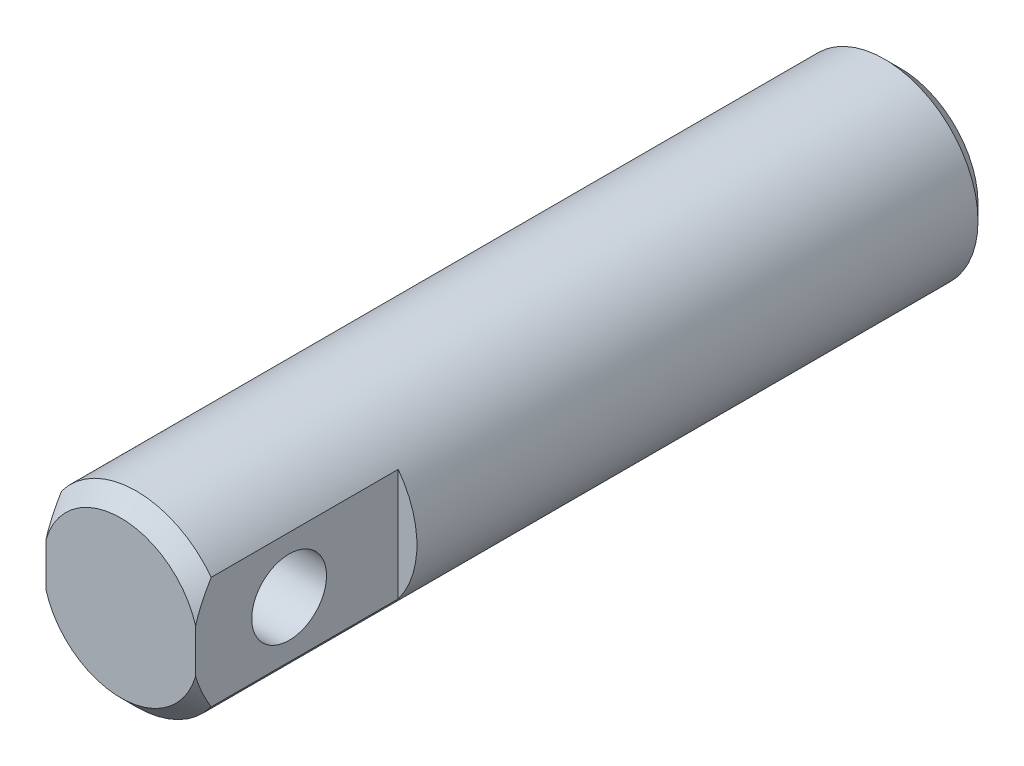
ISO-10303-21;
HEADER;
FILE_DESCRIPTION(('STEP AP214'),'2;1');
FILE_NAME('part.step','',(''),(''),'','','');
FILE_SCHEMA(('AUTOMOTIVE_DESIGN { 1 0 10303 214 1 1 1 1 }'));
ENDSEC;
DATA;
#1=APPLICATION_CONTEXT('core data for automotive mechanical design processes');
#2=APPLICATION_PROTOCOL_DEFINITION('international standard','automotive_design',2000,#1);
#3=PRODUCT_CONTEXT('',#1,'mechanical');
#4=PRODUCT('Part','Part','',(#3));
#5=PRODUCT_RELATED_PRODUCT_CATEGORY('part','',(#4));
#6=PRODUCT_DEFINITION_FORMATION('','',#4);
#7=PRODUCT_DEFINITION_CONTEXT('part definition',#1,'design');
#8=PRODUCT_DEFINITION('design','',#6,#7);
#9=PRODUCT_DEFINITION_SHAPE('','',#8);
#10=(LENGTH_UNIT() NAMED_UNIT(*) SI_UNIT(.MILLI.,.METRE.));
#11=(NAMED_UNIT(*) PLANE_ANGLE_UNIT() SI_UNIT($,.RADIAN.));
#12=(NAMED_UNIT(*) SI_UNIT($,.STERADIAN.) SOLID_ANGLE_UNIT());
#13=UNCERTAINTY_MEASURE_WITH_UNIT(LENGTH_MEASURE(1.E-05),#10,'distance_accuracy_value','');
#14=(GEOMETRIC_REPRESENTATION_CONTEXT(3) GLOBAL_UNCERTAINTY_ASSIGNED_CONTEXT((#13)) GLOBAL_UNIT_ASSIGNED_CONTEXT((#10,
#11,#12)) REPRESENTATION_CONTEXT('',''));
#15=CARTESIAN_POINT('',(0.,0.,0.));
#16=DIRECTION('',(0.,0.,1.));
#17=DIRECTION('',(1.,0.,0.));
#18=AXIS2_PLACEMENT_3D('',#15,#16,#17);
#19=CARTESIAN_POINT('',(0.,0.,0.));
#20=DIRECTION('',(0.,0.,1.));
#21=DIRECTION('',(1.,0.,0.));
#22=AXIS2_PLACEMENT_3D('',#19,#20,#21);
#23=PLANE('',#22);
#24=CARTESIAN_POINT('',(0.,0.,0.));
#25=DIRECTION('',(0.,0.,1.));
#26=DIRECTION('',(1.,0.,0.));
#27=AXIS2_PLACEMENT_3D('',#24,#25,#26);
#28=CIRCLE('',#27,2.5);
#29=CARTESIAN_POINT('',(2.5,0.,0.));
#30=VERTEX_POINT('',#29);
#31=EDGE_CURVE('E213',#30,#30,#28,.F.);
#32=ORIENTED_EDGE('',*,*,#31,.T.);
#33=EDGE_LOOP('',(#32));
#34=FACE_BOUND('',#33,.T.);
#35=DIRECTION('',(0.500185551006506,0.865918249354013,0.));
#36=VECTOR('',#35,1.);
#37=CARTESIAN_POINT('',(0.999257658257273,-1.7324791867189,0.));
#38=LINE('',#37,#36);
#39=CARTESIAN_POINT('',(0.999257658257273,-1.7324791867189,0.));
#40=VERTEX_POINT('',#39);
#41=CARTESIAN_POINT('',(2.,0.,0.));
#42=VERTEX_POINT('',#41);
#43=EDGE_CURVE('E50',#40,#42,#38,.T.);
#44=ORIENTED_EDGE('',*,*,#43,.T.);
#45=DIRECTION('',(-0.500185551006502,0.865918249354015,0.));
#46=VECTOR('',#45,1.);
#47=CARTESIAN_POINT('',(2.,0.,0.));
#48=LINE('',#47,#46);
#49=CARTESIAN_POINT('',(0.999257658257289,1.73247918671889,0.));
#50=VERTEX_POINT('',#49);
#51=EDGE_CURVE('E134',#42,#50,#48,.T.);
#52=ORIENTED_EDGE('',*,*,#51,.T.);
#53=DIRECTION('',(-1.,0.,0.));
#54=VECTOR('',#53,1.);
#55=CARTESIAN_POINT('',(0.999257658257289,1.73247918671889,0.));
#56=LINE('',#55,#54);
#57=CARTESIAN_POINT('',(-0.999257658257288,1.73247918671889,0.));
#58=VERTEX_POINT('',#57);
#59=EDGE_CURVE('E139',#50,#58,#56,.T.);
#60=ORIENTED_EDGE('',*,*,#59,.T.);
#61=DIRECTION('',(-0.500185551006502,-0.865918249354015,0.));
#62=VECTOR('',#61,1.);
#63=CARTESIAN_POINT('',(-0.999257658257288,1.73247918671889,0.));
#64=LINE('',#63,#62);
#65=CARTESIAN_POINT('',(-2.,0.,0.));
#66=VERTEX_POINT('',#65);
#67=EDGE_CURVE('E148',#58,#66,#64,.T.);
#68=ORIENTED_EDGE('',*,*,#67,.T.);
#69=DIRECTION('',(0.500185551006502,-0.865918249354015,0.));
#70=VECTOR('',#69,1.);
#71=CARTESIAN_POINT('',(-2.,0.,0.));
#72=LINE('',#71,#70);
#73=CARTESIAN_POINT('',(-0.999257658257288,-1.73247918671889,0.));
#74=VERTEX_POINT('',#73);
#75=EDGE_CURVE('E151',#66,#74,#72,.T.);
#76=ORIENTED_EDGE('',*,*,#75,.T.);
#77=DIRECTION('',(1.,0.,0.));
#78=VECTOR('',#77,1.);
#79=CARTESIAN_POINT('',(-0.999257658257288,-1.73247918671889,0.));
#80=LINE('',#79,#78);
#81=EDGE_CURVE('E144',#74,#40,#80,.T.);
#82=ORIENTED_EDGE('',*,*,#81,.T.);
#83=EDGE_LOOP('',(#44,#52,#60,#68,#76,#82));
#84=FACE_BOUND('',#83,.T.);
#85=ADVANCED_FACE('F34',(#34,#84),#23,.F.);
#86=CARTESIAN_POINT('',(0.,0.,25.));
#87=DIRECTION('',(0.,0.,-1.));
#88=DIRECTION('',(-1.,0.,0.));
#89=AXIS2_PLACEMENT_3D('',#86,#87,#88);
#90=CONICAL_SURFACE('',#89,2.49999999999999,0.785398163397453);
#91=CARTESIAN_POINT('',(-2.4,-4.86411981016494,22.0760105524034));
#92=CARTESIAN_POINT('',(-2.4,-4.75343904398374,22.1752525757856));
#93=CARTESIAN_POINT('',(-2.4,-4.6424406037317,22.2741434056256));
#94=CARTESIAN_POINT('',(-2.4,-4.41964149150724,22.471036659869));
#95=CARTESIAN_POINT('',(-2.4,-4.30784074934733,22.5690390048052));
#96=CARTESIAN_POINT('',(-2.4,-4.08288344036388,22.7643042597167));
#97=CARTESIAN_POINT('',(-2.4,-3.96972343139538,22.8615632109516));
#98=CARTESIAN_POINT('',(-2.4,-3.74223523526103,23.0546982153357));
#99=CARTESIAN_POINT('',(-2.4,-3.62790709485968,23.1505743234773));
#100=CARTESIAN_POINT('',(-2.4,-3.3910104025022,23.346179976773));
#101=CARTESIAN_POINT('',(-2.4,-3.26835369634245,23.4458030535129));
#102=CARTESIAN_POINT('',(-2.4,-3.02097816963854,23.6424528076332));
#103=CARTESIAN_POINT('',(-2.4,-2.89625945804493,23.739479621488));
#104=CARTESIAN_POINT('',(-2.4,-2.64434021655383,23.9298829737348));
#105=CARTESIAN_POINT('',(-2.4,-2.5171435774399,24.0232646364556));
#106=CARTESIAN_POINT('',(-2.4,-2.25931597512846,24.205135415471));
#107=CARTESIAN_POINT('',(-2.4,-2.12868602597436,24.2936259529448));
#108=CARTESIAN_POINT('',(-2.4,-1.89767283106985,24.4413252876953));
#109=CARTESIAN_POINT('',(-2.4,-1.79831993403233,24.5021369105638));
#110=CARTESIAN_POINT('',(-2.4,-1.59657013004918,24.6186387763622));
#111=CARTESIAN_POINT('',(-2.4,-1.4941720670768,24.6743270406203));
#112=CARTESIAN_POINT('',(-2.4,-1.28681517881027,24.7782510899381));
#113=CARTESIAN_POINT('',(-2.4,-1.18188921636933,24.8265516411797));
#114=CARTESIAN_POINT('',(-2.4,-0.968243341520211,24.9138789881778));
#115=CARTESIAN_POINT('',(-2.4,-0.859526745744456,24.9529136686686));
#116=CARTESIAN_POINT('',(-2.4,-0.67871397867689,25.0067783081651));
#117=CARTESIAN_POINT('',(-2.4,-0.607702554186699,25.0252458479283));
#118=CARTESIAN_POINT('',(-2.4,-0.464445674092852,25.056471746848));
#119=CARTESIAN_POINT('',(-2.4,-0.392200767680878,25.0692325813947));
#120=CARTESIAN_POINT('',(-2.4,-0.246990796707289,25.0883954965482));
#121=CARTESIAN_POINT('',(-2.4,-0.174027217247055,25.0948086890842));
#122=CARTESIAN_POINT('',(-2.4,-0.0278417356907183,25.1009482832641));
#123=CARTESIAN_POINT('',(-2.4,0.0453800332330288,25.1006777369763));
#124=CARTESIAN_POINT('',(-2.4,0.16956235746428,25.0945613107201));
#125=CARTESIAN_POINT('',(-2.4,0.220613638575744,25.090411765334));
#126=CARTESIAN_POINT('',(-2.4,0.322299295142587,25.0789822218707));
#127=CARTESIAN_POINT('',(-2.4,0.372934099273339,25.0717060066299));
#128=CARTESIAN_POINT('',(-2.4,0.510938341223032,25.0477310182714));
#129=CARTESIAN_POINT('',(-2.4,0.597797711718896,25.0280428167905));
#130=CARTESIAN_POINT('',(-2.4,0.76943571705135,24.981032697809));
#131=CARTESIAN_POINT('',(-2.4,0.854212815150112,24.9537053163765));
#132=CARTESIAN_POINT('',(-2.4,1.02248534096135,24.8924616471047));
#133=CARTESIAN_POINT('',(-2.4,1.10595291915121,24.8584697606695));
#134=CARTESIAN_POINT('',(-2.4,1.27057070813172,24.78542488708));
#135=CARTESIAN_POINT('',(-2.4,1.35172188385561,24.7463740459963));
#136=CARTESIAN_POINT('',(-2.4,1.57785101103819,24.6305367888808));
#137=CARTESIAN_POINT('',(-2.4,1.72044850878498,24.5491228979087));
#138=CARTESIAN_POINT('',(-2.4,2.00036407753434,24.3776204493347));
#139=CARTESIAN_POINT('',(-2.4,2.13767732286531,24.2875242141411));
#140=CARTESIAN_POINT('',(-2.4,2.40882965118526,24.1010670385392));
#141=CARTESIAN_POINT('',(-2.4,2.54265111223904,24.0046806560588));
#142=CARTESIAN_POINT('',(-2.4,2.80714311638325,23.8078094638806));
#143=CARTESIAN_POINT('',(-2.4,2.93781480178321,23.7073261766787));
#144=CARTESIAN_POINT('',(-2.4,3.18648942016496,23.511474710958));
#145=CARTESIAN_POINT('',(-2.4,3.30467335525612,23.4163353438188));
#146=CARTESIAN_POINT('',(-2.4,3.53946264006258,23.2241073999028));
#147=CARTESIAN_POINT('',(-2.4,3.65606781755013,23.1270186132858));
#148=CARTESIAN_POINT('',(-2.4,3.88690049850546,22.9322671615092));
#149=CARTESIAN_POINT('',(-2.4,4.00114006976859,22.8346187636832));
#150=CARTESIAN_POINT('',(-2.4,4.22856848808199,22.6381516856835));
#151=CARTESIAN_POINT('',(-2.4,4.34175754513042,22.5393332487987));
#152=CARTESIAN_POINT('',(-2.4,4.45454390995781,22.4400630986403));
#153=B_SPLINE_CURVE_WITH_KNOTS('',3,(#91,#92,#93,#94,#95,#96,#97,#98,#99,#100,#101,#102,#103,
#104,#105,#106,#107,#108,#109,#110,#111,#112,#113,#114,#115,#116,#117,#118,#119,#120,#121,#122,
#123,#124,#125,#126,#127,#128,#129,#130,#131,#132,#133,#134,#135,#136,#137,#138,#139,#140,#141,
#142,#143,#144,#145,#146,#147,#148,#149,#150,#151,#152),.UNSPECIFIED.,.F.,.F.,(4,2,2,2,2,2,2,2,
2,2,2,2,2,2,2,2,2,2,2,2,2,2,2,2,2,2,2,2,2,2,4),(0.,0.445976431845184,0.891992366426567,
1.33962217797752,1.78723413896789,2.26125979314329,2.7352604806808,3.208568880987,
3.6817390245889,4.03108709450084,4.38056952327395,4.72678680371362,5.07270840806284,
5.29263270599269,5.51246151489452,5.73190481600976,5.95124791220119,6.10481157834378,
6.25818997457503,6.52493203717333,6.79186537764819,7.06202293037782,7.33206625196202,
7.82413760975202,8.31664815868376,8.8112917366409,9.30575314082959,9.76088743256992,
10.2160709815331,10.6669202785461,11.1176774206207),.UNSPECIFIED.);
#154=CARTESIAN_POINT('',(-2.4,-1.80000000000002,24.5));
#155=VERTEX_POINT('',#154);
#156=CARTESIAN_POINT('',(-2.4,-0.699999999999971,25.));
#157=VERTEX_POINT('',#156);
#158=EDGE_CURVE('E43',#155,#157,#153,.T.);
#159=ORIENTED_EDGE('',*,*,#158,.F.);
#160=CARTESIAN_POINT('',(0.,0.,24.5));
#161=DIRECTION('',(0.,0.,1.));
#162=DIRECTION('',(1.,0.,0.));
#163=AXIS2_PLACEMENT_3D('',#160,#161,#162);
#164=CIRCLE('',#163,3.);
#165=CARTESIAN_POINT('',(2.4,-1.80000000000002,24.5));
#166=VERTEX_POINT('',#165);
#167=EDGE_CURVE('E210',#166,#155,#164,.F.);
#168=ORIENTED_EDGE('',*,*,#167,.F.);
#169=CARTESIAN_POINT('',(2.4,-4.86411981016494,22.0760105524034));
#170=CARTESIAN_POINT('',(2.4,-4.75343904398374,22.1752525757856));
#171=CARTESIAN_POINT('',(2.4,-4.6424406037317,22.2741434056256));
#172=CARTESIAN_POINT('',(2.4,-4.41964149150725,22.471036659869));
#173=CARTESIAN_POINT('',(2.4,-4.30784074934733,22.5690390048052));
#174=CARTESIAN_POINT('',(2.4,-4.08288344036388,22.7643042597167));
#175=CARTESIAN_POINT('',(2.4,-3.96972343139538,22.8615632109516));
#176=CARTESIAN_POINT('',(2.4,-3.74223523526103,23.0546982153357));
#177=CARTESIAN_POINT('',(2.4,-3.62790709485969,23.1505743234773));
#178=CARTESIAN_POINT('',(2.4,-3.3910104025022,23.346179976773));
#179=CARTESIAN_POINT('',(2.4,-3.26835369634245,23.4458030535129));
#180=CARTESIAN_POINT('',(2.4,-3.02097816963854,23.6424528076332));
#181=CARTESIAN_POINT('',(2.4,-2.89625945804494,23.739479621488));
#182=CARTESIAN_POINT('',(2.4,-2.64434021655383,23.9298829737348));
#183=CARTESIAN_POINT('',(2.4,-2.5171435774399,24.0232646364556));
#184=CARTESIAN_POINT('',(2.4,-2.25931597512846,24.205135415471));
#185=CARTESIAN_POINT('',(2.4,-2.12868602597436,24.2936259529448));
#186=CARTESIAN_POINT('',(2.4,-1.89767283106985,24.4413252876953));
#187=CARTESIAN_POINT('',(2.4,-1.79831993403233,24.5021369105638));
#188=CARTESIAN_POINT('',(2.4,-1.59657013004918,24.6186387763622));
#189=CARTESIAN_POINT('',(2.4,-1.4941720670768,24.6743270406203));
#190=CARTESIAN_POINT('',(2.4,-1.28681517881027,24.7782510899381));
#191=CARTESIAN_POINT('',(2.4,-1.18188921636933,24.8265516411797));
#192=CARTESIAN_POINT('',(2.4,-0.96824334152021,24.9138789881778));
#193=CARTESIAN_POINT('',(2.4,-0.859526745744454,24.9529136686686));
#194=CARTESIAN_POINT('',(2.4,-0.678713978676889,25.0067783081651));
#195=CARTESIAN_POINT('',(2.4,-0.607702554186697,25.0252458479283));
#196=CARTESIAN_POINT('',(2.4,-0.464445674092849,25.056471746848));
#197=CARTESIAN_POINT('',(2.4,-0.392200767680876,25.0692325813947));
#198=CARTESIAN_POINT('',(2.4,-0.246990796707287,25.0883954965482));
#199=CARTESIAN_POINT('',(2.4,-0.174027217247052,25.0948086890842));
#200=CARTESIAN_POINT('',(2.4,-0.0278417356907158,25.1009482832641));
#201=CARTESIAN_POINT('',(2.4,0.0453800332330313,25.1006777369763));
#202=CARTESIAN_POINT('',(2.4,0.169562357464282,25.0945613107201));
#203=CARTESIAN_POINT('',(2.4,0.220613638575746,25.090411765334));
#204=CARTESIAN_POINT('',(2.4,0.322299295142587,25.0789822218707));
#205=CARTESIAN_POINT('',(2.4,0.372934099273339,25.0717060066299));
#206=CARTESIAN_POINT('',(2.4,0.510938341223031,25.0477310182714));
#207=CARTESIAN_POINT('',(2.4,0.597797711718894,25.0280428167905));
#208=CARTESIAN_POINT('',(2.4,0.769435717051348,24.981032697809));
#209=CARTESIAN_POINT('',(2.4,0.85421281515011,24.9537053163765));
#210=CARTESIAN_POINT('',(2.4,1.02248534096134,24.8924616471047));
#211=CARTESIAN_POINT('',(2.4,1.10595291915121,24.8584697606695));
#212=CARTESIAN_POINT('',(2.4,1.27057070813172,24.78542488708));
#213=CARTESIAN_POINT('',(2.4,1.35172188385561,24.7463740459963));
#214=CARTESIAN_POINT('',(2.4,1.57785101103819,24.6305367888808));
#215=CARTESIAN_POINT('',(2.4,1.72044850878498,24.5491228979087));
#216=CARTESIAN_POINT('',(2.4,2.00036407753434,24.3776204493347));
#217=CARTESIAN_POINT('',(2.4,2.13767732286532,24.2875242141411));
#218=CARTESIAN_POINT('',(2.4,2.40882965118526,24.1010670385392));
#219=CARTESIAN_POINT('',(2.4,2.54265111223904,24.0046806560588));
#220=CARTESIAN_POINT('',(2.4,2.80714311638325,23.8078094638806));
#221=CARTESIAN_POINT('',(2.4,2.93781480178322,23.7073261766787));
#222=CARTESIAN_POINT('',(2.4,3.18648942016497,23.511474710958));
#223=CARTESIAN_POINT('',(2.4,3.30467335525612,23.4163353438188));
#224=CARTESIAN_POINT('',(2.4,3.53946264006258,23.2241073999028));
#225=CARTESIAN_POINT('',(2.4,3.65606781755013,23.1270186132858));
#226=CARTESIAN_POINT('',(2.4,3.88690049850546,22.9322671615092));
#227=CARTESIAN_POINT('',(2.4,4.00114006976859,22.8346187636832));
#228=CARTESIAN_POINT('',(2.4,4.22856848808199,22.6381516856835));
#229=CARTESIAN_POINT('',(2.4,4.34175754513042,22.5393332487987));
#230=CARTESIAN_POINT('',(2.4,4.45454390995781,22.4400630986403));
#231=B_SPLINE_CURVE_WITH_KNOTS('',3,(#169,#170,#171,#172,#173,#174,#175,#176,#177,#178,#179,
#180,#181,#182,#183,#184,#185,#186,#187,#188,#189,#190,#191,#192,#193,#194,#195,#196,#197,#198,
#199,#200,#201,#202,#203,#204,#205,#206,#207,#208,#209,#210,#211,#212,#213,#214,#215,#216,#217,
#218,#219,#220,#221,#222,#223,#224,#225,#226,#227,#228,#229,#230),.UNSPECIFIED.,.F.,.F.,(4,2,2,
2,2,2,2,2,2,2,2,2,2,2,2,2,2,2,2,2,2,2,2,2,2,2,2,2,2,2,4),(0.,0.445976431845183,
0.891992366426567,1.33962217797752,1.78723413896788,2.26125979314329,2.7352604806808,
3.208568880987,3.6817390245889,4.03108709450083,4.38056952327395,4.72678680371362,
5.07270840806285,5.2926327059927,5.51246151489452,5.73190481600976,5.95124791220119,
6.10481157834378,6.25818997457503,6.52493203717332,6.79186537764818,7.06202293037781,
7.33206625196202,7.82413760975202,8.31664815868376,8.8112917366409,9.3057531408296,
9.76088743256993,10.2160709815331,10.6669202785461,11.1176774206207),.UNSPECIFIED.);
#232=CARTESIAN_POINT('',(2.4,-0.699999999999972,25.));
#233=VERTEX_POINT('',#232);
#234=EDGE_CURVE('E216',#233,#166,#231,.F.);
#235=ORIENTED_EDGE('',*,*,#234,.F.);
#236=CARTESIAN_POINT('',(0.,0.,25.));
#237=DIRECTION('',(0.,0.,1.));
#238=DIRECTION('',(1.,0.,0.));
#239=AXIS2_PLACEMENT_3D('',#236,#237,#238);
#240=CIRCLE('',#239,2.49999999999999);
#241=EDGE_CURVE('E202',#157,#233,#240,.T.);
#242=ORIENTED_EDGE('',*,*,#241,.F.);
#243=EDGE_LOOP('',(#159,#168,#235,#242));
#244=FACE_BOUND('',#243,.T.);
#245=ADVANCED_FACE('F237',(#244),#90,.T.);
#246=CARTESIAN_POINT('',(0.,0.,25.));
#247=DIRECTION('',(0.,0.,-1.));
#248=DIRECTION('',(-1.,0.,0.));
#249=AXIS2_PLACEMENT_3D('',#246,#247,#248);
#250=CYLINDRICAL_SURFACE('',#249,3.);
#251=ORIENTED_EDGE('',*,*,#167,.T.);
#252=DIRECTION('',(0.,0.,-1.));
#253=VECTOR('',#252,1.);
#254=CARTESIAN_POINT('',(-2.4,-1.8,25.));
#255=LINE('',#254,#253);
#256=CARTESIAN_POINT('',(-2.4,-1.8,18.5));
#257=VERTEX_POINT('',#256);
#258=EDGE_CURVE('E187',#155,#257,#255,.T.);
#259=ORIENTED_EDGE('',*,*,#258,.T.);
#260=CARTESIAN_POINT('',(0.,0.,18.5));
#261=DIRECTION('',(0.,0.,-1.));
#262=DIRECTION('',(-1.,0.,0.));
#263=AXIS2_PLACEMENT_3D('',#260,#261,#262);
#264=CIRCLE('',#263,3.);
#265=CARTESIAN_POINT('',(-2.4,1.8,18.5));
#266=VERTEX_POINT('',#265);
#267=EDGE_CURVE('E11',#257,#266,#264,.T.);
#268=ORIENTED_EDGE('',*,*,#267,.T.);
#269=DIRECTION('',(0.,0.,-1.));
#270=VECTOR('',#269,1.);
#271=CARTESIAN_POINT('',(-2.4,1.8,25.));
#272=LINE('',#271,#270);
#273=CARTESIAN_POINT('',(-2.4,1.8,24.5));
#274=VERTEX_POINT('',#273);
#275=EDGE_CURVE('E184',#266,#274,#272,.F.);
#276=ORIENTED_EDGE('',*,*,#275,.T.);
#277=CARTESIAN_POINT('',(2.4,1.8,24.5));
#278=VERTEX_POINT('',#277);
#279=EDGE_CURVE('E209',#274,#278,#164,.F.);
#280=ORIENTED_EDGE('',*,*,#279,.T.);
#281=DIRECTION('',(0.,0.,-1.));
#282=VECTOR('',#281,1.);
#283=CARTESIAN_POINT('',(2.4,1.8,25.));
#284=LINE('',#283,#282);
#285=CARTESIAN_POINT('',(2.4,1.8,18.5));
#286=VERTEX_POINT('',#285);
#287=EDGE_CURVE('E199',#278,#286,#284,.T.);
#288=ORIENTED_EDGE('',*,*,#287,.T.);
#289=CARTESIAN_POINT('',(0.,0.,18.5));
#290=DIRECTION('',(0.,0.,-1.));
#291=DIRECTION('',(-1.,0.,0.));
#292=AXIS2_PLACEMENT_3D('',#289,#290,#291);
#293=CIRCLE('',#292,3.);
#294=CARTESIAN_POINT('',(2.4,-1.8,18.5));
#295=VERTEX_POINT('',#294);
#296=EDGE_CURVE('E224',#286,#295,#293,.T.);
#297=ORIENTED_EDGE('',*,*,#296,.T.);
#298=DIRECTION('',(0.,0.,-1.));
#299=VECTOR('',#298,1.);
#300=CARTESIAN_POINT('',(2.4,-1.8,25.));
#301=LINE('',#300,#299);
#302=EDGE_CURVE('E196',#295,#166,#301,.F.);
#303=ORIENTED_EDGE('',*,*,#302,.T.);
#304=EDGE_LOOP('',(#251,#259,#268,#276,#280,#288,#297,#303));
#305=FACE_BOUND('',#304,.T.);
#306=CARTESIAN_POINT('',(0.,0.,0.500000000000007));
#307=DIRECTION('',(0.,0.,1.));
#308=DIRECTION('',(1.,0.,0.));
#309=AXIS2_PLACEMENT_3D('',#306,#307,#308);
#310=CIRCLE('',#309,3.);
#311=CARTESIAN_POINT('',(3.,0.,0.500000000000007));
#312=VERTEX_POINT('',#311);
#313=EDGE_CURVE('E206',#312,#312,#310,.T.);
#314=ORIENTED_EDGE('',*,*,#313,.T.);
#315=EDGE_LOOP('',(#314));
#316=FACE_BOUND('',#315,.T.);
#317=ADVANCED_FACE('F36',(#305,#316),#250,.T.);
#318=CARTESIAN_POINT('',(0.,0.,25.));
#319=DIRECTION('',(0.,0.,1.));
#320=DIRECTION('',(1.,0.,0.));
#321=AXIS2_PLACEMENT_3D('',#318,#319,#320);
#322=PLANE('',#321);
#323=DIRECTION('',(0.,1.,0.));
#324=VECTOR('',#323,1.);
#325=CARTESIAN_POINT('',(-2.4,-3.,25.));
#326=LINE('',#325,#324);
#327=CARTESIAN_POINT('',(-2.4,0.699999999999971,25.));
#328=VERTEX_POINT('',#327);
#329=EDGE_CURVE('E58',#157,#328,#326,.T.);
#330=ORIENTED_EDGE('',*,*,#329,.F.);
#331=ORIENTED_EDGE('',*,*,#241,.T.);
#332=DIRECTION('',(0.,-1.,0.));
#333=VECTOR('',#332,1.);
#334=CARTESIAN_POINT('',(2.4,3.,25.));
#335=LINE('',#334,#333);
#336=CARTESIAN_POINT('',(2.4,0.699999999999971,25.));
#337=VERTEX_POINT('',#336);
#338=EDGE_CURVE('E190',#337,#233,#335,.T.);
#339=ORIENTED_EDGE('',*,*,#338,.F.);
#340=EDGE_CURVE('E203',#337,#328,#240,.T.);
#341=ORIENTED_EDGE('',*,*,#340,.T.);
#342=EDGE_LOOP('',(#330,#331,#339,#341));
#343=FACE_BOUND('',#342,.T.);
#344=ADVANCED_FACE('F235',(#343),#322,.T.);
#345=EDGE_CURVE('E239',#328,#274,#153,.T.);
#346=ORIENTED_EDGE('',*,*,#345,.F.);
#347=ORIENTED_EDGE('',*,*,#340,.F.);
#348=EDGE_CURVE('E223',#278,#337,#231,.F.);
#349=ORIENTED_EDGE('',*,*,#348,.F.);
#350=ORIENTED_EDGE('',*,*,#279,.F.);
#351=EDGE_LOOP('',(#346,#347,#349,#350));
#352=FACE_BOUND('',#351,.T.);
#353=ADVANCED_FACE('F230',(#352),#90,.T.);
#354=CARTESIAN_POINT('',(0.,0.,0.500000000000007));
#355=DIRECTION('',(0.,0.,1.));
#356=DIRECTION('',(1.,0.,0.));
#357=AXIS2_PLACEMENT_3D('',#354,#355,#356);
#358=CONICAL_SURFACE('',#357,3.,0.785398163397445);
#359=ORIENTED_EDGE('',*,*,#31,.F.);
#360=EDGE_LOOP('',(#359));
#361=FACE_BOUND('',#360,.T.);
#362=ORIENTED_EDGE('',*,*,#313,.F.);
#363=EDGE_LOOP('',(#362));
#364=FACE_BOUND('',#363,.T.);
#365=ADVANCED_FACE('F234',(#361,#364),#358,.T.);
#366=CARTESIAN_POINT('',(2.4,-3.,18.5));
#367=DIRECTION('',(0.,0.,-1.));
#368=DIRECTION('',(-1.,0.,0.));
#369=AXIS2_PLACEMENT_3D('',#366,#367,#368);
#370=PLANE('',#369);
#371=DIRECTION('',(0.,-1.,0.));
#372=VECTOR('',#371,1.);
#373=CARTESIAN_POINT('',(2.4,3.,18.5));
#374=LINE('',#373,#372);
#375=EDGE_CURVE('E193',#286,#295,#374,.T.);
#376=ORIENTED_EDGE('',*,*,#375,.T.);
#377=ORIENTED_EDGE('',*,*,#296,.F.);
#378=EDGE_LOOP('',(#376,#377));
#379=FACE_BOUND('',#378,.T.);
#380=ADVANCED_FACE('F252',(#379),#370,.F.);
#381=CARTESIAN_POINT('',(2.4,3.,18.5));
#382=DIRECTION('',(-1.,0.,0.));
#383=DIRECTION('',(0.,-1.,0.));
#384=AXIS2_PLACEMENT_3D('',#381,#382,#383);
#385=PLANE('',#384);
#386=CARTESIAN_POINT('',(2.4,0.,22.));
#387=DIRECTION('',(1.,0.,0.));
#388=DIRECTION('',(0.,1.,0.));
#389=AXIS2_PLACEMENT_3D('',#386,#387,#388);
#390=CIRCLE('',#389,1.2);
#391=CARTESIAN_POINT('',(2.4,1.2,22.));
#392=VERTEX_POINT('',#391);
#393=EDGE_CURVE('E130',#392,#392,#390,.T.);
#394=ORIENTED_EDGE('',*,*,#393,.F.);
#395=EDGE_LOOP('',(#394));
#396=FACE_BOUND('',#395,.T.);
#397=ORIENTED_EDGE('',*,*,#348,.T.);
#398=ORIENTED_EDGE('',*,*,#338,.T.);
#399=ORIENTED_EDGE('',*,*,#234,.T.);
#400=ORIENTED_EDGE('',*,*,#302,.F.);
#401=ORIENTED_EDGE('',*,*,#375,.F.);
#402=ORIENTED_EDGE('',*,*,#287,.F.);
#403=EDGE_LOOP('',(#397,#398,#399,#400,#401,#402));
#404=FACE_BOUND('',#403,.T.);
#405=ADVANCED_FACE('F226',(#396,#404),#385,.F.);
#406=CARTESIAN_POINT('',(-4.4,-3.,18.5));
#407=DIRECTION('',(0.,0.,-1.));
#408=DIRECTION('',(-1.,0.,0.));
#409=AXIS2_PLACEMENT_3D('',#406,#407,#408);
#410=PLANE('',#409);
#411=DIRECTION('',(0.,1.,0.));
#412=VECTOR('',#411,1.);
#413=CARTESIAN_POINT('',(-2.4,-3.,18.5));
#414=LINE('',#413,#412);
#415=EDGE_CURVE('E181',#257,#266,#414,.T.);
#416=ORIENTED_EDGE('',*,*,#415,.T.);
#417=ORIENTED_EDGE('',*,*,#267,.F.);
#418=EDGE_LOOP('',(#416,#417));
#419=FACE_BOUND('',#418,.T.);
#420=ADVANCED_FACE('F249',(#419),#410,.F.);
#421=CARTESIAN_POINT('',(-2.4,-3.,18.5));
#422=DIRECTION('',(1.,0.,0.));
#423=DIRECTION('',(0.,0.,-1.));
#424=AXIS2_PLACEMENT_3D('',#421,#422,#423);
#425=PLANE('',#424);
#426=CARTESIAN_POINT('',(-2.4,0.,22.));
#427=DIRECTION('',(1.,0.,0.));
#428=DIRECTION('',(0.,0.,-1.));
#429=AXIS2_PLACEMENT_3D('',#426,#427,#428);
#430=CIRCLE('',#429,1.2);
#431=CARTESIAN_POINT('',(-2.4,1.2,22.));
#432=VERTEX_POINT('',#431);
#433=EDGE_CURVE('E38',#432,#432,#430,.T.);
#434=ORIENTED_EDGE('',*,*,#433,.T.);
#435=EDGE_LOOP('',(#434));
#436=FACE_BOUND('',#435,.T.);
#437=ORIENTED_EDGE('',*,*,#158,.T.);
#438=ORIENTED_EDGE('',*,*,#329,.T.);
#439=ORIENTED_EDGE('',*,*,#345,.T.);
#440=ORIENTED_EDGE('',*,*,#275,.F.);
#441=ORIENTED_EDGE('',*,*,#415,.F.);
#442=ORIENTED_EDGE('',*,*,#258,.F.);
#443=EDGE_LOOP('',(#437,#438,#439,#440,#441,#442));
#444=FACE_BOUND('',#443,.T.);
#445=ADVANCED_FACE('F244',(#436,#444),#425,.F.);
#446=CARTESIAN_POINT('',(-3.,0.,22.));
#447=DIRECTION('',(1.,0.,0.));
#448=DIRECTION('',(0.,1.,0.));
#449=AXIS2_PLACEMENT_3D('',#446,#447,#448);
#450=CYLINDRICAL_SURFACE('',#449,1.2);
#451=CARTESIAN_POINT('',(2.4,1.2,22.));
#452=CARTESIAN_POINT('',(2.35,1.2,22.));
#453=CARTESIAN_POINT('',(2.3,1.2,22.));
#454=CARTESIAN_POINT('',(2.2,1.2,22.));
#455=CARTESIAN_POINT('',(2.15,1.2,22.));
#456=CARTESIAN_POINT('',(2.05,1.2,22.));
#457=CARTESIAN_POINT('',(2.,1.2,22.));
#458=CARTESIAN_POINT('',(1.9,1.2,22.));
#459=CARTESIAN_POINT('',(1.85,1.2,22.));
#460=CARTESIAN_POINT('',(1.75,1.2,22.));
#461=CARTESIAN_POINT('',(1.7,1.2,22.));
#462=CARTESIAN_POINT('',(1.6,1.2,22.));
#463=CARTESIAN_POINT('',(1.55,1.2,22.));
#464=CARTESIAN_POINT('',(1.45,1.2,22.));
#465=CARTESIAN_POINT('',(1.4,1.2,22.));
#466=CARTESIAN_POINT('',(1.3,1.2,22.));
#467=CARTESIAN_POINT('',(1.25,1.2,22.));
#468=CARTESIAN_POINT('',(1.15,1.2,22.));
#469=CARTESIAN_POINT('',(1.1,1.2,22.));
#470=CARTESIAN_POINT('',(1.,1.2,22.));
#471=CARTESIAN_POINT('',(0.95,1.2,22.));
#472=CARTESIAN_POINT('',(0.850000000000001,1.2,22.));
#473=CARTESIAN_POINT('',(0.800000000000001,1.2,22.));
#474=CARTESIAN_POINT('',(0.700000000000001,1.2,22.));
#475=CARTESIAN_POINT('',(0.650000000000001,1.2,22.));
#476=CARTESIAN_POINT('',(0.550000000000001,1.2,22.));
#477=CARTESIAN_POINT('',(0.500000000000001,1.2,22.));
#478=CARTESIAN_POINT('',(0.400000000000001,1.2,22.));
#479=CARTESIAN_POINT('',(0.35,1.2,22.));
#480=CARTESIAN_POINT('',(0.25,1.2,22.));
#481=CARTESIAN_POINT('',(0.2,1.2,22.));
#482=CARTESIAN_POINT('',(0.1,1.2,22.));
#483=CARTESIAN_POINT('',(0.0500000000000004,1.2,22.));
#484=CARTESIAN_POINT('',(-0.0499999999999995,1.2,22.));
#485=CARTESIAN_POINT('',(-0.0999999999999995,1.2,22.));
#486=CARTESIAN_POINT('',(-0.199999999999999,1.2,22.));
#487=CARTESIAN_POINT('',(-0.25,1.2,22.));
#488=CARTESIAN_POINT('',(-0.35,1.2,22.));
#489=CARTESIAN_POINT('',(-0.4,1.2,22.));
#490=CARTESIAN_POINT('',(-0.5,1.2,22.));
#491=CARTESIAN_POINT('',(-0.55,1.2,22.));
#492=CARTESIAN_POINT('',(-0.65,1.2,22.));
#493=CARTESIAN_POINT('',(-0.7,1.2,22.));
#494=CARTESIAN_POINT('',(-0.8,1.2,22.));
#495=CARTESIAN_POINT('',(-0.85,1.2,22.));
#496=CARTESIAN_POINT('',(-0.95,1.2,22.));
#497=CARTESIAN_POINT('',(-1.,1.2,22.));
#498=CARTESIAN_POINT('',(-1.1,1.2,22.));
#499=CARTESIAN_POINT('',(-1.15,1.2,22.));
#500=CARTESIAN_POINT('',(-1.25,1.2,22.));
#501=CARTESIAN_POINT('',(-1.3,1.2,22.));
#502=CARTESIAN_POINT('',(-1.4,1.2,22.));
#503=CARTESIAN_POINT('',(-1.45,1.2,22.));
#504=CARTESIAN_POINT('',(-1.55,1.2,22.));
#505=CARTESIAN_POINT('',(-1.6,1.2,22.));
#506=CARTESIAN_POINT('',(-1.7,1.2,22.));
#507=CARTESIAN_POINT('',(-1.75,1.2,22.));
#508=CARTESIAN_POINT('',(-1.85,1.2,22.));
#509=CARTESIAN_POINT('',(-1.9,1.2,22.));
#510=CARTESIAN_POINT('',(-2.,1.2,22.));
#511=CARTESIAN_POINT('',(-2.05,1.2,22.));
#512=CARTESIAN_POINT('',(-2.15,1.2,22.));
#513=CARTESIAN_POINT('',(-2.2,1.2,22.));
#514=CARTESIAN_POINT('',(-2.3,1.2,22.));
#515=CARTESIAN_POINT('',(-2.35,1.2,22.));
#516=CARTESIAN_POINT('',(-2.4,1.2,22.));
#517=B_SPLINE_CURVE_WITH_KNOTS('',3,(#451,#452,#453,#454,#455,#456,#457,#458,#459,#460,#461,
#462,#463,#464,#465,#466,#467,#468,#469,#470,#471,#472,#473,#474,#475,#476,#477,#478,#479,#480,
#481,#482,#483,#484,#485,#486,#487,#488,#489,#490,#491,#492,#493,#494,#495,#496,#497,#498,#499,
#500,#501,#502,#503,#504,#505,#506,#507,#508,#509,#510,#511,#512,#513,#514,#515,#516),
.UNSPECIFIED.,.F.,.F.,(4,2,2,2,2,2,2,2,2,2,2,2,2,2,2,2,2,2,2,2,2,2,2,2,2,2,2,2,2,2,2,2,4),(0.,
0.15,0.3,0.45,0.6,0.750000000000001,0.9,1.05,1.2,1.35,1.5,1.65,1.8,1.95,2.1,2.25,2.4,2.55,2.7,
2.85,3.,3.15,3.3,3.45,3.6,3.75,3.9,4.05,4.2,4.35,4.5,4.65,4.8),.UNSPECIFIED.);
#518=EDGE_CURVE('BSEAM248',#392,#432,#517,.T.);
#519=ORIENTED_EDGE('',*,*,#393,.T.);
#520=ORIENTED_EDGE('',*,*,#433,.F.);
#521=ORIENTED_EDGE('',*,*,#518,.T.);
#522=ORIENTED_EDGE('',*,*,#518,.F.);
#523=EDGE_LOOP('',(#519,#521,#520,#522));
#524=FACE_BOUND('',#523,.T.);
#525=ADVANCED_FACE('F248',(#524),#450,.F.);
#526=CARTESIAN_POINT('',(0.999257658257273,-1.7324791867189,3.5));
#527=DIRECTION('',(-0.865918249354013,0.500185551006506,0.));
#528=DIRECTION('',(-0.500185551006506,-0.865918249354013,0.));
#529=AXIS2_PLACEMENT_3D('',#526,#527,#528);
#530=PLANE('',#529);
#531=DIRECTION('',(0.,0.,-1.));
#532=VECTOR('',#531,1.);
#533=CARTESIAN_POINT('',(2.,0.,3.5));
#534=LINE('',#533,#532);
#535=CARTESIAN_POINT('',(2.,0.,3.5));
#536=VERTEX_POINT('',#535);
#537=EDGE_CURVE('E122',#536,#42,#534,.T.);
#538=ORIENTED_EDGE('',*,*,#537,.T.);
#539=ORIENTED_EDGE('',*,*,#43,.F.);
#540=DIRECTION('',(0.,0.,-1.));
#541=VECTOR('',#540,1.);
#542=CARTESIAN_POINT('',(0.999257658257273,-1.7324791867189,3.5));
#543=LINE('',#542,#541);
#544=CARTESIAN_POINT('',(0.999257658257273,-1.7324791867189,3.5));
#545=VERTEX_POINT('',#544);
#546=EDGE_CURVE('E169',#545,#40,#543,.T.);
#547=ORIENTED_EDGE('',*,*,#546,.F.);
#548=DIRECTION('',(0.500185551006506,0.865918249354013,0.));
#549=VECTOR('',#548,1.);
#550=CARTESIAN_POINT('',(0.999257658257273,-1.7324791867189,3.5));
#551=LINE('',#550,#549);
#552=EDGE_CURVE('E126',#545,#536,#551,.T.);
#553=ORIENTED_EDGE('',*,*,#552,.T.);
#554=EDGE_LOOP('',(#538,#539,#547,#553));
#555=FACE_BOUND('',#554,.T.);
#556=ADVANCED_FACE('F124',(#555),#530,.T.);
#557=CARTESIAN_POINT('',(2.,0.,3.5));
#558=DIRECTION('',(-0.865918249354015,-0.500185551006502,0.));
#559=DIRECTION('',(0.500185551006502,-0.865918249354015,0.));
#560=AXIS2_PLACEMENT_3D('',#557,#558,#559);
#561=PLANE('',#560);
#562=DIRECTION('',(0.,0.,-1.));
#563=VECTOR('',#562,1.);
#564=CARTESIAN_POINT('',(0.999257658257289,1.73247918671889,3.5));
#565=LINE('',#564,#563);
#566=CARTESIAN_POINT('',(0.999257658257289,1.73247918671889,3.5));
#567=VERTEX_POINT('',#566);
#568=EDGE_CURVE('E131',#567,#50,#565,.T.);
#569=ORIENTED_EDGE('',*,*,#568,.T.);
#570=ORIENTED_EDGE('',*,*,#51,.F.);
#571=ORIENTED_EDGE('',*,*,#537,.F.);
#572=DIRECTION('',(-0.500185551006502,0.865918249354015,0.));
#573=VECTOR('',#572,1.);
#574=CARTESIAN_POINT('',(2.,0.,3.5));
#575=LINE('',#574,#573);
#576=EDGE_CURVE('E155',#536,#567,#575,.T.);
#577=ORIENTED_EDGE('',*,*,#576,.T.);
#578=EDGE_LOOP('',(#569,#570,#571,#577));
#579=FACE_BOUND('',#578,.T.);
#580=ADVANCED_FACE('F135',(#579),#561,.T.);
#581=CARTESIAN_POINT('',(0.999257658257289,1.73247918671889,3.5));
#582=DIRECTION('',(0.,-1.,0.));
#583=DIRECTION('',(0.,0.,-1.));
#584=AXIS2_PLACEMENT_3D('',#581,#582,#583);
#585=PLANE('',#584);
#586=DIRECTION('',(0.,0.,-1.));
#587=VECTOR('',#586,1.);
#588=CARTESIAN_POINT('',(-0.999257658257288,1.73247918671889,3.5));
#589=LINE('',#588,#587);
#590=CARTESIAN_POINT('',(-0.999257658257288,1.73247918671889,3.5));
#591=VERTEX_POINT('',#590);
#592=EDGE_CURVE('E175',#591,#58,#589,.T.);
#593=ORIENTED_EDGE('',*,*,#592,.T.);
#594=ORIENTED_EDGE('',*,*,#59,.F.);
#595=ORIENTED_EDGE('',*,*,#568,.F.);
#596=DIRECTION('',(-1.,0.,0.));
#597=VECTOR('',#596,1.);
#598=CARTESIAN_POINT('',(0.999257658257289,1.73247918671889,3.5));
#599=LINE('',#598,#597);
#600=EDGE_CURVE('E157',#567,#591,#599,.T.);
#601=ORIENTED_EDGE('',*,*,#600,.T.);
#602=EDGE_LOOP('',(#593,#594,#595,#601));
#603=FACE_BOUND('',#602,.T.);
#604=ADVANCED_FACE('F316',(#603),#585,.T.);
#605=CARTESIAN_POINT('',(-0.999257658257288,1.73247918671889,3.5));
#606=DIRECTION('',(0.865918249354015,-0.500185551006502,0.));
#607=DIRECTION('',(0.500185551006502,0.865918249354015,0.));
#608=AXIS2_PLACEMENT_3D('',#605,#606,#607);
#609=PLANE('',#608);
#610=DIRECTION('',(0.,0.,-1.));
#611=VECTOR('',#610,1.);
#612=CARTESIAN_POINT('',(-2.,0.,3.5));
#613=LINE('',#612,#611);
#614=CARTESIAN_POINT('',(-2.,0.,3.5));
#615=VERTEX_POINT('',#614);
#616=EDGE_CURVE('E173',#615,#66,#613,.T.);
#617=ORIENTED_EDGE('',*,*,#616,.T.);
#618=ORIENTED_EDGE('',*,*,#67,.F.);
#619=ORIENTED_EDGE('',*,*,#592,.F.);
#620=DIRECTION('',(-0.500185551006502,-0.865918249354015,0.));
#621=VECTOR('',#620,1.);
#622=CARTESIAN_POINT('',(-0.999257658257288,1.73247918671889,3.5));
#623=LINE('',#622,#621);
#624=EDGE_CURVE('E160',#591,#615,#623,.T.);
#625=ORIENTED_EDGE('',*,*,#624,.T.);
#626=EDGE_LOOP('',(#617,#618,#619,#625));
#627=FACE_BOUND('',#626,.T.);
#628=ADVANCED_FACE('F323',(#627),#609,.T.);
#629=CARTESIAN_POINT('',(-2.,0.,3.5));
#630=DIRECTION('',(0.865918249354015,0.500185551006502,0.));
#631=DIRECTION('',(-0.500185551006502,0.865918249354015,0.));
#632=AXIS2_PLACEMENT_3D('',#629,#630,#631);
#633=PLANE('',#632);
#634=DIRECTION('',(0.,0.,-1.));
#635=VECTOR('',#634,1.);
#636=CARTESIAN_POINT('',(-0.999257658257288,-1.73247918671889,3.5));
#637=LINE('',#636,#635);
#638=CARTESIAN_POINT('',(-0.999257658257288,-1.73247918671889,3.5));
#639=VERTEX_POINT('',#638);
#640=EDGE_CURVE('E171',#639,#74,#637,.T.);
#641=ORIENTED_EDGE('',*,*,#640,.T.);
#642=ORIENTED_EDGE('',*,*,#75,.F.);
#643=ORIENTED_EDGE('',*,*,#616,.F.);
#644=DIRECTION('',(0.500185551006502,-0.865918249354015,0.));
#645=VECTOR('',#644,1.);
#646=CARTESIAN_POINT('',(-2.,0.,3.5));
#647=LINE('',#646,#645);
#648=EDGE_CURVE('E163',#615,#639,#647,.T.);
#649=ORIENTED_EDGE('',*,*,#648,.T.);
#650=EDGE_LOOP('',(#641,#642,#643,#649));
#651=FACE_BOUND('',#650,.T.);
#652=ADVANCED_FACE('F331',(#651),#633,.T.);
#653=CARTESIAN_POINT('',(-0.999257658257288,-1.73247918671889,3.5));
#654=DIRECTION('',(0.,1.,0.));
#655=DIRECTION('',(-1.,0.,0.));
#656=AXIS2_PLACEMENT_3D('',#653,#654,#655);
#657=PLANE('',#656);
#658=DIRECTION('',(1.,0.,0.));
#659=VECTOR('',#658,1.);
#660=CARTESIAN_POINT('',(-0.999257658257288,-1.73247918671889,3.5));
#661=LINE('',#660,#659);
#662=EDGE_CURVE('E166',#639,#545,#661,.T.);
#663=ORIENTED_EDGE('',*,*,#662,.T.);
#664=ORIENTED_EDGE('',*,*,#546,.T.);
#665=ORIENTED_EDGE('',*,*,#81,.F.);
#666=ORIENTED_EDGE('',*,*,#640,.F.);
#667=EDGE_LOOP('',(#663,#664,#665,#666));
#668=FACE_BOUND('',#667,.T.);
#669=ADVANCED_FACE('F339',(#668),#657,.T.);
#670=CARTESIAN_POINT('',(0.,-3.46238809822299,3.5));
#671=DIRECTION('',(0.,0.,-1.));
#672=DIRECTION('',(-1.,0.,0.));
#673=AXIS2_PLACEMENT_3D('',#670,#671,#672);
#674=PLANE('',#673);
#675=ORIENTED_EDGE('',*,*,#552,.F.);
#676=ORIENTED_EDGE('',*,*,#662,.F.);
#677=ORIENTED_EDGE('',*,*,#648,.F.);
#678=ORIENTED_EDGE('',*,*,#624,.F.);
#679=ORIENTED_EDGE('',*,*,#600,.F.);
#680=ORIENTED_EDGE('',*,*,#576,.F.);
#681=EDGE_LOOP('',(#675,#676,#677,#678,#679,#680));
#682=FACE_BOUND('',#681,.T.);
#683=ADVANCED_FACE('F342',(#682),#674,.T.);
#684=CLOSED_SHELL('',(#85,#245,#317,#344,#353,#365,#380,#405,#420,#445,#525,#556,#580,#604,#628,
#652,#669,#683));
#685=MANIFOLD_SOLID_BREP('B2',#684);
#686=ADVANCED_BREP_SHAPE_REPRESENTATION('',(#18,#685),#14);
#687=SHAPE_DEFINITION_REPRESENTATION(#9,#686);
ENDSEC;
END-ISO-10303-21;
